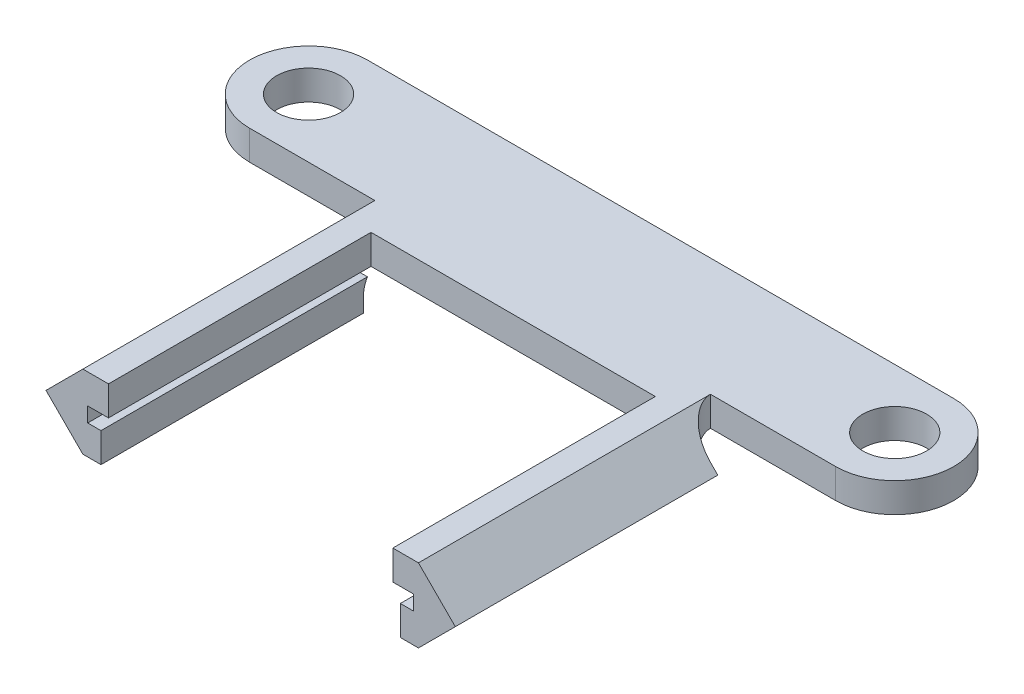
ISO-10303-21;
HEADER;
FILE_DESCRIPTION(('STEP AP214'),'2;1');
FILE_NAME('part.step','',(''),(''),'','','');
FILE_SCHEMA(('AUTOMOTIVE_DESIGN { 1 0 10303 214 1 1 1 1 }'));
ENDSEC;
DATA;
#1=APPLICATION_CONTEXT('core data for automotive mechanical design processes');
#2=APPLICATION_PROTOCOL_DEFINITION('international standard','automotive_design',2000,#1);
#3=PRODUCT_CONTEXT('',#1,'mechanical');
#4=PRODUCT('Part','Part','',(#3));
#5=PRODUCT_RELATED_PRODUCT_CATEGORY('part','',(#4));
#6=PRODUCT_DEFINITION_FORMATION('','',#4);
#7=PRODUCT_DEFINITION_CONTEXT('part definition',#1,'design');
#8=PRODUCT_DEFINITION('design','',#6,#7);
#9=PRODUCT_DEFINITION_SHAPE('','',#8);
#10=(LENGTH_UNIT() NAMED_UNIT(*) SI_UNIT(.MILLI.,.METRE.));
#11=(NAMED_UNIT(*) PLANE_ANGLE_UNIT() SI_UNIT($,.RADIAN.));
#12=(NAMED_UNIT(*) SI_UNIT($,.STERADIAN.) SOLID_ANGLE_UNIT());
#13=UNCERTAINTY_MEASURE_WITH_UNIT(LENGTH_MEASURE(1.E-05),#10,'distance_accuracy_value','');
#14=(GEOMETRIC_REPRESENTATION_CONTEXT(3) GLOBAL_UNCERTAINTY_ASSIGNED_CONTEXT((#13)) GLOBAL_UNIT_ASSIGNED_CONTEXT((#10,
#11,#12)) REPRESENTATION_CONTEXT('',''));
#15=CARTESIAN_POINT('',(0.,0.,0.));
#16=DIRECTION('',(0.,0.,1.));
#17=DIRECTION('',(1.,0.,0.));
#18=AXIS2_PLACEMENT_3D('',#15,#16,#17);
#19=CARTESIAN_POINT('',(0.,0.,0.));
#20=DIRECTION('',(0.,0.,-1.));
#21=DIRECTION('',(-1.,0.,0.));
#22=AXIS2_PLACEMENT_3D('',#19,#20,#21);
#23=PLANE('',#22);
#24=DIRECTION('',(0.,1.,0.));
#25=VECTOR('',#24,1.);
#26=CARTESIAN_POINT('',(26.289,0.,0.));
#27=LINE('',#26,#25);
#28=CARTESIAN_POINT('',(26.289,-2.54,0.));
#29=VERTEX_POINT('',#28);
#30=CARTESIAN_POINT('',(26.289,-1.27,0.));
#31=VERTEX_POINT('',#30);
#32=EDGE_CURVE('E305',#29,#31,#27,.T.);
#33=ORIENTED_EDGE('',*,*,#32,.T.);
#34=DIRECTION('',(-1.,0.,0.));
#35=VECTOR('',#34,1.);
#36=CARTESIAN_POINT('',(27.8491024484277,-1.27,0.));
#37=LINE('',#36,#35);
#38=CARTESIAN_POINT('',(29.1191024484277,-1.27,0.));
#39=VERTEX_POINT('',#38);
#40=EDGE_CURVE('E396',#31,#39,#37,.F.);
#41=ORIENTED_EDGE('',*,*,#40,.T.);
#42=DIRECTION('',(0.707106781186547,0.707106781186548,0.));
#43=VECTOR('',#42,1.);
#44=CARTESIAN_POINT('',(27.8491024484277,-2.54,0.));
#45=LINE('',#44,#43);
#46=CARTESIAN_POINT('',(27.8491024484277,-2.54,0.));
#47=VERTEX_POINT('',#46);
#48=EDGE_CURVE('E344',#47,#39,#45,.T.);
#49=ORIENTED_EDGE('',*,*,#48,.F.);
#50=DIRECTION('',(1.,0.,0.));
#51=VECTOR('',#50,1.);
#52=CARTESIAN_POINT('',(25.9715,-2.54,0.));
#53=LINE('',#52,#51);
#54=EDGE_CURVE('E362',#29,#47,#53,.T.);
#55=ORIENTED_EDGE('',*,*,#54,.F.);
#56=EDGE_LOOP('',(#33,#41,#49,#55));
#57=FACE_BOUND('',#56,.T.);
#58=ADVANCED_FACE('F33',(#57),#23,.T.);
#59=DIRECTION('',(0.707106781186548,-0.707106781186547,0.));
#60=VECTOR('',#59,1.);
#61=CARTESIAN_POINT('',(-1.05210244842766,-2.54,0.));
#62=LINE('',#61,#60);
#63=CARTESIAN_POINT('',(-2.32210244842766,-1.27,0.));
#64=VERTEX_POINT('',#63);
#65=CARTESIAN_POINT('',(-1.05210244842766,-2.54,0.));
#66=VERTEX_POINT('',#65);
#67=EDGE_CURVE('E339',#64,#66,#62,.T.);
#68=ORIENTED_EDGE('',*,*,#67,.F.);
#69=DIRECTION('',(-1.,0.,0.));
#70=VECTOR('',#69,1.);
#71=CARTESIAN_POINT('',(-0.635,-1.27,0.));
#72=LINE('',#71,#70);
#73=CARTESIAN_POINT('',(0.507999999999999,-1.27,0.));
#74=VERTEX_POINT('',#73);
#75=EDGE_CURVE('E390',#64,#74,#72,.F.);
#76=ORIENTED_EDGE('',*,*,#75,.T.);
#77=DIRECTION('',(0.,-1.,0.));
#78=VECTOR('',#77,1.);
#79=CARTESIAN_POINT('',(0.508,0.,0.));
#80=LINE('',#79,#78);
#81=CARTESIAN_POINT('',(0.507999999999998,-2.54,0.));
#82=VERTEX_POINT('',#81);
#83=EDGE_CURVE('E303',#74,#82,#80,.T.);
#84=ORIENTED_EDGE('',*,*,#83,.T.);
#85=EDGE_CURVE('E363',#66,#82,#53,.T.);
#86=ORIENTED_EDGE('',*,*,#85,.F.);
#87=EDGE_LOOP('',(#68,#76,#84,#86));
#88=FACE_BOUND('',#87,.T.);
#89=ADVANCED_FACE('F487',(#88),#23,.T.);
#90=CARTESIAN_POINT('',(31.0241024484277,0.635,22.606));
#91=DIRECTION('',(-0.707106781186547,-0.707106781186548,0.));
#92=DIRECTION('',(0.707106781186548,-0.707106781186547,0.));
#93=AXIS2_PLACEMENT_3D('',#90,#91,#92);
#94=PLANE('',#93);
#95=DIRECTION('',(-0.707106781186548,0.707106781186547,0.));
#96=VECTOR('',#95,1.);
#97=CARTESIAN_POINT('',(27.8491024484277,3.81,0.));
#98=LINE('',#97,#96);
#99=CARTESIAN_POINT('',(31.0241024484277,0.635,0.));
#100=VERTEX_POINT('',#99);
#101=CARTESIAN_POINT('',(30.3891024484277,1.27,0.));
#102=VERTEX_POINT('',#101);
#103=EDGE_CURVE('E266',#100,#102,#98,.T.);
#104=ORIENTED_EDGE('',*,*,#103,.T.);
#105=CARTESIAN_POINT('',(30.3891024484277,1.27,-2.54));
#106=DIRECTION('',(-0.707106781186547,-0.707106781186548,0.));
#107=DIRECTION('',(0.707106781186548,-0.707106781186547,0.));
#108=AXIS2_PLACEMENT_3D('',#105,#106,#107);
#109=ELLIPSE('',#108,3.59210244842766,2.54);
#110=CARTESIAN_POINT('',(27.8491024484277,3.81,-2.54));
#111=VERTEX_POINT('',#110);
#112=EDGE_CURVE('E12',#102,#111,#109,.T.);
#113=ORIENTED_EDGE('',*,*,#112,.T.);
#114=DIRECTION('',(0.,0.,-1.));
#115=VECTOR('',#114,1.);
#116=CARTESIAN_POINT('',(27.8491024484277,3.81,22.606));
#117=LINE('',#116,#115);
#118=CARTESIAN_POINT('',(27.8491024484277,3.81,22.606));
#119=VERTEX_POINT('',#118);
#120=EDGE_CURVE('E50',#119,#111,#117,.T.);
#121=ORIENTED_EDGE('',*,*,#120,.F.);
#122=DIRECTION('',(-0.707106781186548,0.707106781186547,0.));
#123=VECTOR('',#122,1.);
#124=CARTESIAN_POINT('',(31.0241024484277,0.635,22.606));
#125=LINE('',#124,#123);
#126=CARTESIAN_POINT('',(31.0241024484277,0.635,22.606));
#127=VERTEX_POINT('',#126);
#128=EDGE_CURVE('E350',#127,#119,#125,.T.);
#129=ORIENTED_EDGE('',*,*,#128,.F.);
#130=DIRECTION('',(0.,0.,-1.));
#131=VECTOR('',#130,1.);
#132=CARTESIAN_POINT('',(31.0241024484277,0.635,22.606));
#133=LINE('',#132,#131);
#134=EDGE_CURVE('E375',#127,#100,#133,.T.);
#135=ORIENTED_EDGE('',*,*,#134,.T.);
#136=EDGE_LOOP('',(#104,#113,#121,#129,#135));
#137=FACE_BOUND('',#136,.T.);
#138=ADVANCED_FACE('F494',(#137),#94,.F.);
#139=CARTESIAN_POINT('',(-4.22710244842766,0.634999999999996,22.606));
#140=DIRECTION('',(0.707106781186548,-0.707106781186547,0.));
#141=DIRECTION('',(0.707106781186547,0.707106781186548,0.));
#142=AXIS2_PLACEMENT_3D('',#139,#140,#141);
#143=PLANE('',#142);
#144=DIRECTION('',(0.,0.,-1.));
#145=VECTOR('',#144,1.);
#146=CARTESIAN_POINT('',(-1.05210244842766,3.81,22.606));
#147=LINE('',#146,#145);
#148=CARTESIAN_POINT('',(-1.05210244842766,3.81,22.606));
#149=VERTEX_POINT('',#148);
#150=CARTESIAN_POINT('',(-1.05210244842766,3.81,-2.53999999999999));
#151=VERTEX_POINT('',#150);
#152=EDGE_CURVE('E371',#149,#151,#147,.T.);
#153=ORIENTED_EDGE('',*,*,#152,.T.);
#154=CARTESIAN_POINT('',(-3.59210244842766,1.26999999999999,-2.54));
#155=DIRECTION('',(0.707106781186548,-0.707106781186547,0.));
#156=DIRECTION('',(0.707106781186547,0.707106781186548,0.));
#157=AXIS2_PLACEMENT_3D('',#154,#155,#156);
#158=ELLIPSE('',#157,3.59210244842766,2.54);
#159=CARTESIAN_POINT('',(-3.59210244842766,1.27,0.));
#160=VERTEX_POINT('',#159);
#161=EDGE_CURVE('E412',#151,#160,#158,.T.);
#162=ORIENTED_EDGE('',*,*,#161,.T.);
#163=DIRECTION('',(-0.707106781186547,-0.707106781186548,0.));
#164=VECTOR('',#163,1.);
#165=CARTESIAN_POINT('',(-1.05210244842766,3.81,0.));
#166=LINE('',#165,#164);
#167=CARTESIAN_POINT('',(-4.22710244842766,0.635000000000004,0.));
#168=VERTEX_POINT('',#167);
#169=EDGE_CURVE('E270',#160,#168,#166,.T.);
#170=ORIENTED_EDGE('',*,*,#169,.T.);
#171=DIRECTION('',(0.,0.,-1.));
#172=VECTOR('',#171,1.);
#173=CARTESIAN_POINT('',(-4.22710244842766,0.634999999999996,22.606));
#174=LINE('',#173,#172);
#175=CARTESIAN_POINT('',(-4.22710244842766,0.634999999999996,22.606));
#176=VERTEX_POINT('',#175);
#177=EDGE_CURVE('E358',#176,#168,#174,.T.);
#178=ORIENTED_EDGE('',*,*,#177,.F.);
#179=DIRECTION('',(-0.707106781186547,-0.707106781186548,0.));
#180=VECTOR('',#179,1.);
#181=CARTESIAN_POINT('',(-4.22710244842766,0.634999999999996,22.606));
#182=LINE('',#181,#180);
#183=EDGE_CURVE('E356',#149,#176,#182,.T.);
#184=ORIENTED_EDGE('',*,*,#183,.F.);
#185=EDGE_LOOP('',(#153,#162,#170,#178,#184));
#186=FACE_BOUND('',#185,.T.);
#187=ADVANCED_FACE('F537',(#186),#143,.F.);
#188=CARTESIAN_POINT('',(27.432,1.27,22.606));
#189=DIRECTION('',(-1.,0.,0.));
#190=DIRECTION('',(0.,0.,1.));
#191=AXIS2_PLACEMENT_3D('',#188,#189,#190);
#192=PLANE('',#191);
#193=DIRECTION('',(0.,0.,-1.));
#194=VECTOR('',#193,1.);
#195=CARTESIAN_POINT('',(27.432,1.27,22.606));
#196=LINE('',#195,#194);
#197=CARTESIAN_POINT('',(27.432,1.27,22.606));
#198=VERTEX_POINT('',#197);
#199=CARTESIAN_POINT('',(27.432,1.27,-2.53999999999999));
#200=VERTEX_POINT('',#199);
#201=EDGE_CURVE('E335',#198,#200,#196,.T.);
#202=ORIENTED_EDGE('',*,*,#201,.T.);
#203=CARTESIAN_POINT('',(27.432,-1.27,-2.54));
#204=DIRECTION('',(-1.,0.,0.));
#205=DIRECTION('',(0.,0.,1.));
#206=AXIS2_PLACEMENT_3D('',#203,#204,#205);
#207=CIRCLE('',#206,2.54);
#208=CARTESIAN_POINT('',(27.432,0.,-0.34029547438752));
#209=VERTEX_POINT('',#208);
#210=EDGE_CURVE('E416',#200,#209,#207,.F.);
#211=ORIENTED_EDGE('',*,*,#210,.T.);
#212=DIRECTION('',(0.,0.,-1.));
#213=VECTOR('',#212,1.);
#214=CARTESIAN_POINT('',(27.432,0.,22.606));
#215=LINE('',#214,#213);
#216=CARTESIAN_POINT('',(27.432,0.,22.606));
#217=VERTEX_POINT('',#216);
#218=EDGE_CURVE('E337',#217,#209,#215,.T.);
#219=ORIENTED_EDGE('',*,*,#218,.F.);
#220=DIRECTION('',(0.,1.,0.));
#221=VECTOR('',#220,1.);
#222=CARTESIAN_POINT('',(27.432,1.27,22.606));
#223=LINE('',#222,#221);
#224=EDGE_CURVE('E323',#217,#198,#223,.T.);
#225=ORIENTED_EDGE('',*,*,#224,.T.);
#226=EDGE_LOOP('',(#202,#211,#219,#225));
#227=FACE_BOUND('',#226,.T.);
#228=ADVANCED_FACE('F563',(#227),#192,.T.);
#229=CARTESIAN_POINT('',(-0.635,1.27,22.606));
#230=DIRECTION('',(1.,0.,0.));
#231=DIRECTION('',(0.,0.,-1.));
#232=AXIS2_PLACEMENT_3D('',#229,#230,#231);
#233=PLANE('',#232);
#234=DIRECTION('',(0.,0.,-1.));
#235=VECTOR('',#234,1.);
#236=CARTESIAN_POINT('',(-0.635,0.,22.606));
#237=LINE('',#236,#235);
#238=CARTESIAN_POINT('',(-0.635,0.,22.606));
#239=VERTEX_POINT('',#238);
#240=CARTESIAN_POINT('',(-0.635,0.,-0.34029547438752));
#241=VERTEX_POINT('',#240);
#242=EDGE_CURVE('E331',#239,#241,#237,.T.);
#243=ORIENTED_EDGE('',*,*,#242,.T.);
#244=CARTESIAN_POINT('',(-0.635,-1.27,-2.54));
#245=DIRECTION('',(1.,0.,0.));
#246=DIRECTION('',(0.,0.,-1.));
#247=AXIS2_PLACEMENT_3D('',#244,#245,#246);
#248=CIRCLE('',#247,2.54);
#249=CARTESIAN_POINT('',(-0.635,1.27,-2.53999999999999));
#250=VERTEX_POINT('',#249);
#251=EDGE_CURVE('E409',#241,#250,#248,.F.);
#252=ORIENTED_EDGE('',*,*,#251,.T.);
#253=DIRECTION('',(0.,0.,-1.));
#254=VECTOR('',#253,1.);
#255=CARTESIAN_POINT('',(-0.635,1.27,22.606));
#256=LINE('',#255,#254);
#257=CARTESIAN_POINT('',(-0.635,1.27,22.606));
#258=VERTEX_POINT('',#257);
#259=EDGE_CURVE('E333',#258,#250,#256,.T.);
#260=ORIENTED_EDGE('',*,*,#259,.F.);
#261=DIRECTION('',(0.,-1.,0.));
#262=VECTOR('',#261,1.);
#263=CARTESIAN_POINT('',(-0.635,1.27,22.606));
#264=LINE('',#263,#262);
#265=EDGE_CURVE('E329',#258,#239,#264,.T.);
#266=ORIENTED_EDGE('',*,*,#265,.T.);
#267=EDGE_LOOP('',(#243,#252,#260,#266));
#268=FACE_BOUND('',#267,.T.);
#269=ADVANCED_FACE('F523',(#268),#233,.T.);
#270=CARTESIAN_POINT('',(0.,0.,22.606));
#271=DIRECTION('',(0.,0.,-1.));
#272=DIRECTION('',(-1.,0.,0.));
#273=AXIS2_PLACEMENT_3D('',#270,#271,#272);
#274=PLANE('',#273);
#275=DIRECTION('',(-1.,0.,0.));
#276=VECTOR('',#275,1.);
#277=CARTESIAN_POINT('',(26.797,1.27,22.606));
#278=LINE('',#277,#276);
#279=CARTESIAN_POINT('',(1.1557,1.27,22.606));
#280=VERTEX_POINT('',#279);
#281=EDGE_CURVE('E325',#280,#258,#278,.T.);
#282=ORIENTED_EDGE('',*,*,#281,.F.);
#283=DIRECTION('',(0.,1.,0.));
#284=VECTOR('',#283,1.);
#285=CARTESIAN_POINT('',(1.1557,1.27,22.606));
#286=LINE('',#285,#284);
#287=CARTESIAN_POINT('',(1.1557,3.81,22.606));
#288=VERTEX_POINT('',#287);
#289=EDGE_CURVE('E283',#280,#288,#286,.T.);
#290=ORIENTED_EDGE('',*,*,#289,.T.);
#291=DIRECTION('',(-1.,0.,0.));
#292=VECTOR('',#291,1.);
#293=CARTESIAN_POINT('',(25.9715,3.81,22.606));
#294=LINE('',#293,#292);
#295=EDGE_CURVE('E352',#288,#149,#294,.T.);
#296=ORIENTED_EDGE('',*,*,#295,.T.);
#297=ORIENTED_EDGE('',*,*,#183,.T.);
#298=DIRECTION('',(0.707106781186548,-0.707106781186547,0.));
#299=VECTOR('',#298,1.);
#300=CARTESIAN_POINT('',(-1.05210244842766,-2.54,22.606));
#301=LINE('',#300,#299);
#302=CARTESIAN_POINT('',(-1.05210244842766,-2.54,22.606));
#303=VERTEX_POINT('',#302);
#304=EDGE_CURVE('E340',#176,#303,#301,.T.);
#305=ORIENTED_EDGE('',*,*,#304,.T.);
#306=DIRECTION('',(1.,0.,0.));
#307=VECTOR('',#306,1.);
#308=CARTESIAN_POINT('',(0.825500000000002,-2.54,22.606));
#309=LINE('',#308,#307);
#310=CARTESIAN_POINT('',(0.507999999999998,-2.54,22.606));
#311=VERTEX_POINT('',#310);
#312=EDGE_CURVE('E345',#303,#311,#309,.T.);
#313=ORIENTED_EDGE('',*,*,#312,.T.);
#314=DIRECTION('',(0.,-1.,0.));
#315=VECTOR('',#314,1.);
#316=CARTESIAN_POINT('',(0.508,0.,22.606));
#317=LINE('',#316,#315);
#318=CARTESIAN_POINT('',(0.508,0.,22.606));
#319=VERTEX_POINT('',#318);
#320=EDGE_CURVE('E302',#319,#311,#317,.T.);
#321=ORIENTED_EDGE('',*,*,#320,.F.);
#322=DIRECTION('',(1.,0.,0.));
#323=VECTOR('',#322,1.);
#324=CARTESIAN_POINT('',(-0.635,0.,22.606));
#325=LINE('',#324,#323);
#326=EDGE_CURVE('E320',#239,#319,#325,.T.);
#327=ORIENTED_EDGE('',*,*,#326,.F.);
#328=ORIENTED_EDGE('',*,*,#265,.F.);
#329=EDGE_LOOP('',(#282,#290,#296,#297,#305,#313,#321,#327,#328));
#330=FACE_BOUND('',#329,.T.);
#331=ADVANCED_FACE('F512',(#330),#274,.F.);
#332=ORIENTED_EDGE('',*,*,#169,.F.);
#333=DIRECTION('',(0.,1.,0.));
#334=VECTOR('',#333,1.);
#335=CARTESIAN_POINT('',(-3.59210244842766,0.,0.));
#336=LINE('',#335,#334);
#337=CARTESIAN_POINT('',(-3.59210244842766,0.,0.));
#338=VERTEX_POINT('',#337);
#339=EDGE_CURVE('E388',#160,#338,#336,.F.);
#340=ORIENTED_EDGE('',*,*,#339,.T.);
#341=EDGE_CURVE('E359',#168,#338,#62,.T.);
#342=ORIENTED_EDGE('',*,*,#341,.F.);
#343=EDGE_LOOP('',(#332,#340,#342));
#344=FACE_BOUND('',#343,.T.);
#345=ADVANCED_FACE('F496',(#344),#23,.T.);
#346=CARTESIAN_POINT('',(25.9715,-2.54,22.606));
#347=DIRECTION('',(0.,1.,0.));
#348=DIRECTION('',(0.,0.,1.));
#349=AXIS2_PLACEMENT_3D('',#346,#347,#348);
#350=PLANE('',#349);
#351=ORIENTED_EDGE('',*,*,#85,.T.);
#352=DIRECTION('',(0.,0.,1.));
#353=VECTOR('',#352,1.);
#354=CARTESIAN_POINT('',(0.507999999999998,-2.54,0.));
#355=LINE('',#354,#353);
#356=EDGE_CURVE('E309',#82,#311,#355,.T.);
#357=ORIENTED_EDGE('',*,*,#356,.T.);
#358=ORIENTED_EDGE('',*,*,#312,.F.);
#359=DIRECTION('',(0.,0.,-1.));
#360=VECTOR('',#359,1.);
#361=CARTESIAN_POINT('',(-1.05210244842766,-2.54,22.606));
#362=LINE('',#361,#360);
#363=EDGE_CURVE('E381',#303,#66,#362,.T.);
#364=ORIENTED_EDGE('',*,*,#363,.T.);
#365=EDGE_LOOP('',(#351,#357,#358,#364));
#366=FACE_BOUND('',#365,.T.);
#367=ADVANCED_FACE('F515',(#366),#350,.F.);
#368=CARTESIAN_POINT('',(27.432,0.,22.606));
#369=DIRECTION('',(0.,1.,0.));
#370=DIRECTION('',(0.,0.,1.));
#371=AXIS2_PLACEMENT_3D('',#368,#369,#370);
#372=PLANE('',#371);
#373=DIRECTION('',(0.,0.,1.));
#374=VECTOR('',#373,1.);
#375=CARTESIAN_POINT('',(0.508,0.,0.));
#376=LINE('',#375,#374);
#377=CARTESIAN_POINT('',(0.508,0.,-0.340295474387526));
#378=VERTEX_POINT('',#377);
#379=EDGE_CURVE('E312',#378,#319,#376,.T.);
#380=ORIENTED_EDGE('',*,*,#379,.F.);
#381=DIRECTION('',(1.,0.,0.));
#382=VECTOR('',#381,1.);
#383=CARTESIAN_POINT('',(0.508,0.,-0.340295474387526));
#384=LINE('',#383,#382);
#385=EDGE_CURVE('E406',#378,#241,#384,.F.);
#386=ORIENTED_EDGE('',*,*,#385,.T.);
#387=ORIENTED_EDGE('',*,*,#242,.F.);
#388=ORIENTED_EDGE('',*,*,#326,.T.);
#389=EDGE_LOOP('',(#380,#386,#387,#388));
#390=FACE_BOUND('',#389,.T.);
#391=ADVANCED_FACE('F510',(#390),#372,.T.);
#392=CARTESIAN_POINT('',(25.6413,3.81,22.606));
#393=VERTEX_POINT('',#392);
#394=EDGE_CURVE('E353',#119,#393,#294,.T.);
#395=ORIENTED_EDGE('',*,*,#394,.T.);
#396=DIRECTION('',(0.,1.,0.));
#397=VECTOR('',#396,1.);
#398=CARTESIAN_POINT('',(25.6413,1.27,22.606));
#399=LINE('',#398,#397);
#400=CARTESIAN_POINT('',(25.6413,1.27,22.606));
#401=VERTEX_POINT('',#400);
#402=EDGE_CURVE('E295',#401,#393,#399,.T.);
#403=ORIENTED_EDGE('',*,*,#402,.F.);
#404=EDGE_CURVE('E326',#198,#401,#278,.T.);
#405=ORIENTED_EDGE('',*,*,#404,.F.);
#406=ORIENTED_EDGE('',*,*,#224,.F.);
#407=CARTESIAN_POINT('',(26.289,0.,22.606));
#408=VERTEX_POINT('',#407);
#409=EDGE_CURVE('E314',#408,#217,#325,.T.);
#410=ORIENTED_EDGE('',*,*,#409,.F.);
#411=DIRECTION('',(0.,1.,0.));
#412=VECTOR('',#411,1.);
#413=CARTESIAN_POINT('',(26.289,0.,22.606));
#414=LINE('',#413,#412);
#415=CARTESIAN_POINT('',(26.289,-2.54,22.606));
#416=VERTEX_POINT('',#415);
#417=EDGE_CURVE('E306',#416,#408,#414,.T.);
#418=ORIENTED_EDGE('',*,*,#417,.F.);
#419=CARTESIAN_POINT('',(27.8491024484277,-2.54,22.606));
#420=VERTEX_POINT('',#419);
#421=EDGE_CURVE('E343',#416,#420,#309,.T.);
#422=ORIENTED_EDGE('',*,*,#421,.T.);
#423=DIRECTION('',(0.707106781186547,0.707106781186548,0.));
#424=VECTOR('',#423,1.);
#425=CARTESIAN_POINT('',(27.8491024484277,-2.54,22.606));
#426=LINE('',#425,#424);
#427=EDGE_CURVE('E348',#420,#127,#426,.T.);
#428=ORIENTED_EDGE('',*,*,#427,.T.);
#429=ORIENTED_EDGE('',*,*,#128,.T.);
#430=EDGE_LOOP('',(#395,#403,#405,#406,#410,#418,#422,#428,#429));
#431=FACE_BOUND('',#430,.T.);
#432=ADVANCED_FACE('F501',(#431),#274,.F.);
#433=CARTESIAN_POINT('',(30.3891024484277,0.,0.));
#434=VERTEX_POINT('',#433);
#435=EDGE_CURVE('E366',#434,#100,#45,.T.);
#436=ORIENTED_EDGE('',*,*,#435,.F.);
#437=DIRECTION('',(0.,-1.,0.));
#438=VECTOR('',#437,1.);
#439=CARTESIAN_POINT('',(30.3891024484277,0.,0.));
#440=LINE('',#439,#438);
#441=EDGE_CURVE('E394',#434,#102,#440,.F.);
#442=ORIENTED_EDGE('',*,*,#441,.T.);
#443=ORIENTED_EDGE('',*,*,#103,.F.);
#444=EDGE_LOOP('',(#436,#442,#443));
#445=FACE_BOUND('',#444,.T.);
#446=ADVANCED_FACE('F490',(#445),#23,.T.);
#447=CARTESIAN_POINT('',(-1.05210244842766,-2.54,22.606));
#448=DIRECTION('',(0.707106781186547,0.707106781186548,0.));
#449=DIRECTION('',(-0.707106781186548,0.707106781186547,0.));
#450=AXIS2_PLACEMENT_3D('',#447,#448,#449);
#451=PLANE('',#450);
#452=ORIENTED_EDGE('',*,*,#341,.T.);
#453=CARTESIAN_POINT('',(-3.59210244842766,0.,-2.54));
#454=DIRECTION('',(0.707106781186547,0.707106781186548,0.));
#455=DIRECTION('',(-0.707106781186548,0.707106781186547,0.));
#456=AXIS2_PLACEMENT_3D('',#453,#454,#455);
#457=ELLIPSE('',#456,3.59210244842766,2.54);
#458=CARTESIAN_POINT('',(-2.95710244842766,-0.634999999999999,-0.0806555751582914));
#459=VERTEX_POINT('',#458);
#460=EDGE_CURVE('E414',#338,#459,#457,.T.);
#461=ORIENTED_EDGE('',*,*,#460,.T.);
#462=CARTESIAN_POINT('',(-2.32210244842766,-1.27,-2.54));
#463=DIRECTION('',(0.707106781186547,0.707106781186548,0.));
#464=DIRECTION('',(0.707106781186548,-0.707106781186547,0.));
#465=AXIS2_PLACEMENT_3D('',#462,#463,#464);
#466=ELLIPSE('',#465,3.59210244842766,2.54);
#467=EDGE_CURVE('E401',#459,#64,#466,.T.);
#468=ORIENTED_EDGE('',*,*,#467,.T.);
#469=ORIENTED_EDGE('',*,*,#67,.T.);
#470=ORIENTED_EDGE('',*,*,#363,.F.);
#471=ORIENTED_EDGE('',*,*,#304,.F.);
#472=ORIENTED_EDGE('',*,*,#177,.T.);
#473=EDGE_LOOP('',(#452,#461,#468,#469,#470,#471,#472));
#474=FACE_BOUND('',#473,.T.);
#475=ADVANCED_FACE('F500',(#474),#451,.F.);
#476=ORIENTED_EDGE('',*,*,#421,.F.);
#477=DIRECTION('',(0.,0.,1.));
#478=VECTOR('',#477,1.);
#479=CARTESIAN_POINT('',(26.289,-2.54,0.));
#480=LINE('',#479,#478);
#481=EDGE_CURVE('E316',#29,#416,#480,.T.);
#482=ORIENTED_EDGE('',*,*,#481,.F.);
#483=ORIENTED_EDGE('',*,*,#54,.T.);
#484=DIRECTION('',(0.,0.,-1.));
#485=VECTOR('',#484,1.);
#486=CARTESIAN_POINT('',(27.8491024484277,-2.54,22.606));
#487=LINE('',#486,#485);
#488=EDGE_CURVE('E378',#420,#47,#487,.T.);
#489=ORIENTED_EDGE('',*,*,#488,.F.);
#490=EDGE_LOOP('',(#476,#482,#483,#489));
#491=FACE_BOUND('',#490,.T.);
#492=ADVANCED_FACE('F507',(#491),#350,.F.);
#493=CARTESIAN_POINT('',(27.8491024484277,-2.54,22.606));
#494=DIRECTION('',(-0.707106781186548,0.707106781186547,0.));
#495=DIRECTION('',(-0.707106781186547,-0.707106781186548,0.));
#496=AXIS2_PLACEMENT_3D('',#493,#494,#495);
#497=PLANE('',#496);
#498=ORIENTED_EDGE('',*,*,#48,.T.);
#499=CARTESIAN_POINT('',(29.1191024484277,-1.27,-2.54));
#500=DIRECTION('',(-0.707106781186548,0.707106781186547,0.));
#501=DIRECTION('',(0.707106781186547,0.707106781186548,0.));
#502=AXIS2_PLACEMENT_3D('',#499,#500,#501);
#503=ELLIPSE('',#502,3.59210244842766,2.54);
#504=CARTESIAN_POINT('',(29.7541024484277,-0.635000000000002,-0.0806555751582901));
#505=VERTEX_POINT('',#504);
#506=EDGE_CURVE('E423',#39,#505,#503,.T.);
#507=ORIENTED_EDGE('',*,*,#506,.T.);
#508=CARTESIAN_POINT('',(30.3891024484277,0.,-2.54));
#509=DIRECTION('',(-0.707106781186548,0.707106781186547,0.));
#510=DIRECTION('',(-0.707106781186547,-0.707106781186548,0.));
#511=AXIS2_PLACEMENT_3D('',#508,#509,#510);
#512=ELLIPSE('',#511,3.59210244842766,2.54);
#513=EDGE_CURVE('E42',#505,#434,#512,.T.);
#514=ORIENTED_EDGE('',*,*,#513,.T.);
#515=ORIENTED_EDGE('',*,*,#435,.T.);
#516=ORIENTED_EDGE('',*,*,#134,.F.);
#517=ORIENTED_EDGE('',*,*,#427,.F.);
#518=ORIENTED_EDGE('',*,*,#488,.T.);
#519=EDGE_LOOP('',(#498,#507,#514,#515,#516,#517,#518));
#520=FACE_BOUND('',#519,.T.);
#521=ADVANCED_FACE('F574',(#520),#497,.F.);
#522=CARTESIAN_POINT('',(0.825499999999998,3.81,22.606));
#523=DIRECTION('',(0.,-1.,0.));
#524=DIRECTION('',(1.,0.,0.));
#525=AXIS2_PLACEMENT_3D('',#522,#523,#524);
#526=PLANE('',#525);
#527=CARTESIAN_POINT('',(38.63848,3.81000000000001,-7.61999999999999));
#528=DIRECTION('',(0.,-1.,0.));
#529=DIRECTION('',(0.,0.,-1.));
#530=AXIS2_PLACEMENT_3D('',#527,#528,#529);
#531=CIRCLE('',#530,2.75);
#532=CARTESIAN_POINT('',(38.63848,3.81000000000001,-10.37));
#533=VERTEX_POINT('',#532);
#534=EDGE_CURVE('E457',#533,#533,#531,.T.);
#535=ORIENTED_EDGE('',*,*,#534,.T.);
#536=EDGE_LOOP('',(#535));
#537=FACE_BOUND('',#536,.T.);
#538=CARTESIAN_POINT('',(-11.84148,3.81000000000001,-7.62));
#539=DIRECTION('',(0.,-1.,0.));
#540=DIRECTION('',(0.,0.,-1.));
#541=AXIS2_PLACEMENT_3D('',#538,#539,#540);
#542=CIRCLE('',#541,2.75);
#543=CARTESIAN_POINT('',(-11.84148,3.81000000000001,-10.37));
#544=VERTEX_POINT('',#543);
#545=EDGE_CURVE('E246',#544,#544,#542,.T.);
#546=ORIENTED_EDGE('',*,*,#545,.T.);
#547=EDGE_LOOP('',(#546));
#548=FACE_BOUND('',#547,.T.);
#549=ORIENTED_EDGE('',*,*,#120,.T.);
#550=DIRECTION('',(1.,0.,0.));
#551=VECTOR('',#550,1.);
#552=CARTESIAN_POINT('',(27.8491024484277,3.81000000000001,-2.54));
#553=LINE('',#552,#551);
#554=CARTESIAN_POINT('',(38.63848,3.81000000000001,-2.54));
#555=VERTEX_POINT('',#554);
#556=EDGE_CURVE('E446',#111,#555,#553,.T.);
#557=ORIENTED_EDGE('',*,*,#556,.T.);
#558=CARTESIAN_POINT('',(38.63848,3.81000000000001,-7.61999999999999));
#559=DIRECTION('',(0.,-1.,0.));
#560=DIRECTION('',(1.,0.,0.));
#561=AXIS2_PLACEMENT_3D('',#558,#559,#560);
#562=CIRCLE('',#561,5.07999999999999);
#563=CARTESIAN_POINT('',(38.63848,3.81000000000001,-12.7));
#564=VERTEX_POINT('',#563);
#565=EDGE_CURVE('E259',#555,#564,#562,.F.);
#566=ORIENTED_EDGE('',*,*,#565,.T.);
#567=DIRECTION('',(1.,0.,0.));
#568=VECTOR('',#567,1.);
#569=CARTESIAN_POINT('',(-1.05210244842766,3.81,-12.7));
#570=LINE('',#569,#568);
#571=CARTESIAN_POINT('',(-11.84148,3.81,-12.7));
#572=VERTEX_POINT('',#571);
#573=EDGE_CURVE('E300',#572,#564,#570,.T.);
#574=ORIENTED_EDGE('',*,*,#573,.F.);
#575=CARTESIAN_POINT('',(-11.84148,3.81,-7.62));
#576=DIRECTION('',(0.,-1.,0.));
#577=DIRECTION('',(1.,0.,0.));
#578=AXIS2_PLACEMENT_3D('',#575,#576,#577);
#579=CIRCLE('',#578,5.07999999999999);
#580=CARTESIAN_POINT('',(-11.84148,3.81,-2.54000000000001));
#581=VERTEX_POINT('',#580);
#582=EDGE_CURVE('E264',#572,#581,#579,.F.);
#583=ORIENTED_EDGE('',*,*,#582,.T.);
#584=EDGE_CURVE('E238',#581,#151,#553,.T.);
#585=ORIENTED_EDGE('',*,*,#584,.T.);
#586=ORIENTED_EDGE('',*,*,#152,.F.);
#587=ORIENTED_EDGE('',*,*,#295,.F.);
#588=DIRECTION('',(0.,0.,1.));
#589=VECTOR('',#588,1.);
#590=CARTESIAN_POINT('',(1.1557,3.81,0.));
#591=LINE('',#590,#589);
#592=CARTESIAN_POINT('',(1.1557,3.81,0.));
#593=VERTEX_POINT('',#592);
#594=EDGE_CURVE('E269',#593,#288,#591,.T.);
#595=ORIENTED_EDGE('',*,*,#594,.F.);
#596=DIRECTION('',(-1.,0.,0.));
#597=VECTOR('',#596,1.);
#598=CARTESIAN_POINT('',(2.9845,3.81,0.));
#599=LINE('',#598,#597);
#600=CARTESIAN_POINT('',(25.6413,3.81,0.));
#601=VERTEX_POINT('',#600);
#602=EDGE_CURVE('E277',#601,#593,#599,.T.);
#603=ORIENTED_EDGE('',*,*,#602,.F.);
#604=DIRECTION('',(0.,0.,-1.));
#605=VECTOR('',#604,1.);
#606=CARTESIAN_POINT('',(25.6413,3.81,22.606));
#607=LINE('',#606,#605);
#608=EDGE_CURVE('E285',#393,#601,#607,.T.);
#609=ORIENTED_EDGE('',*,*,#608,.F.);
#610=ORIENTED_EDGE('',*,*,#394,.F.);
#611=EDGE_LOOP('',(#549,#557,#566,#574,#583,#585,#586,#587,#595,#603,#609,#610));
#612=FACE_BOUND('',#611,.T.);
#613=ADVANCED_FACE('F542',(#537,#548,#612),#526,.F.);
#614=DIRECTION('',(0.,0.,1.));
#615=VECTOR('',#614,1.);
#616=CARTESIAN_POINT('',(26.289,0.,0.));
#617=LINE('',#616,#615);
#618=CARTESIAN_POINT('',(26.289,0.,-0.340295474387526));
#619=VERTEX_POINT('',#618);
#620=EDGE_CURVE('E57',#619,#408,#617,.T.);
#621=ORIENTED_EDGE('',*,*,#620,.T.);
#622=ORIENTED_EDGE('',*,*,#409,.T.);
#623=ORIENTED_EDGE('',*,*,#218,.T.);
#624=DIRECTION('',(1.,0.,0.));
#625=VECTOR('',#624,1.);
#626=CARTESIAN_POINT('',(27.432,0.,-0.340295474387526));
#627=LINE('',#626,#625);
#628=EDGE_CURVE('E419',#209,#619,#627,.F.);
#629=ORIENTED_EDGE('',*,*,#628,.T.);
#630=EDGE_LOOP('',(#621,#622,#623,#629));
#631=FACE_BOUND('',#630,.T.);
#632=ADVANCED_FACE('F469',(#631),#372,.T.);
#633=CARTESIAN_POINT('',(0.,1.27,22.606));
#634=DIRECTION('',(0.,-1.,0.));
#635=DIRECTION('',(0.,0.,-1.));
#636=AXIS2_PLACEMENT_3D('',#633,#634,#635);
#637=PLANE('',#636);
#638=CARTESIAN_POINT('',(38.63848,1.27,-7.61999999999999));
#639=DIRECTION('',(0.,-1.,0.));
#640=DIRECTION('',(0.,0.,-1.));
#641=AXIS2_PLACEMENT_3D('',#638,#639,#640);
#642=CIRCLE('',#641,2.75);
#643=CARTESIAN_POINT('',(38.63848,1.27,-10.37));
#644=VERTEX_POINT('',#643);
#645=EDGE_CURVE('E460',#644,#644,#642,.T.);
#646=ORIENTED_EDGE('',*,*,#645,.F.);
#647=EDGE_LOOP('',(#646));
#648=FACE_BOUND('',#647,.T.);
#649=CARTESIAN_POINT('',(-11.84148,1.27,-7.62));
#650=DIRECTION('',(0.,-1.,0.));
#651=DIRECTION('',(0.,0.,-1.));
#652=AXIS2_PLACEMENT_3D('',#649,#650,#651);
#653=CIRCLE('',#652,2.75);
#654=CARTESIAN_POINT('',(-11.84148,1.27,-10.37));
#655=VERTEX_POINT('',#654);
#656=EDGE_CURVE('E251',#655,#655,#653,.T.);
#657=ORIENTED_EDGE('',*,*,#656,.F.);
#658=EDGE_LOOP('',(#657));
#659=FACE_BOUND('',#658,.T.);
#660=ORIENTED_EDGE('',*,*,#259,.T.);
#661=DIRECTION('',(-1.,0.,0.));
#662=VECTOR('',#661,1.);
#663=CARTESIAN_POINT('',(-1.05210244842766,1.27,-2.54));
#664=LINE('',#663,#662);
#665=CARTESIAN_POINT('',(-1.05210244842766,1.27,-2.54));
#666=VERTEX_POINT('',#665);
#667=EDGE_CURVE('E227',#250,#666,#664,.T.);
#668=ORIENTED_EDGE('',*,*,#667,.T.);
#669=DIRECTION('',(-1.,0.,0.));
#670=VECTOR('',#669,1.);
#671=CARTESIAN_POINT('',(27.8491024484277,1.27,-2.54));
#672=LINE('',#671,#670);
#673=CARTESIAN_POINT('',(-11.84148,1.27,-2.54000000000001));
#674=VERTEX_POINT('',#673);
#675=EDGE_CURVE('E221',#666,#674,#672,.T.);
#676=ORIENTED_EDGE('',*,*,#675,.T.);
#677=CARTESIAN_POINT('',(-11.84148,1.27,-7.62));
#678=DIRECTION('',(0.,-1.,0.));
#679=DIRECTION('',(0.,0.,1.));
#680=AXIS2_PLACEMENT_3D('',#677,#678,#679);
#681=CIRCLE('',#680,5.07999999999999);
#682=CARTESIAN_POINT('',(-11.84148,1.27,-12.7));
#683=VERTEX_POINT('',#682);
#684=EDGE_CURVE('E225',#674,#683,#681,.T.);
#685=ORIENTED_EDGE('',*,*,#684,.T.);
#686=DIRECTION('',(-1.,0.,0.));
#687=VECTOR('',#686,1.);
#688=CARTESIAN_POINT('',(27.432,1.27,-12.7));
#689=LINE('',#688,#687);
#690=CARTESIAN_POINT('',(38.63848,1.27,-12.7));
#691=VERTEX_POINT('',#690);
#692=EDGE_CURVE('E292',#691,#683,#689,.T.);
#693=ORIENTED_EDGE('',*,*,#692,.F.);
#694=CARTESIAN_POINT('',(38.63848,1.27,-7.61999999999999));
#695=DIRECTION('',(0.,-1.,0.));
#696=DIRECTION('',(0.,0.,-1.));
#697=AXIS2_PLACEMENT_3D('',#694,#695,#696);
#698=CIRCLE('',#697,5.07999999999999);
#699=CARTESIAN_POINT('',(38.63848,1.27,-2.54));
#700=VERTEX_POINT('',#699);
#701=EDGE_CURVE('E231',#691,#700,#698,.T.);
#702=ORIENTED_EDGE('',*,*,#701,.T.);
#703=CARTESIAN_POINT('',(27.8491024484277,1.27,-2.54));
#704=VERTEX_POINT('',#703);
#705=EDGE_CURVE('E230',#700,#704,#672,.T.);
#706=ORIENTED_EDGE('',*,*,#705,.T.);
#707=DIRECTION('',(-1.,0.,0.));
#708=VECTOR('',#707,1.);
#709=CARTESIAN_POINT('',(27.432,1.27,-2.54));
#710=LINE('',#709,#708);
#711=EDGE_CURVE('E384',#704,#200,#710,.T.);
#712=ORIENTED_EDGE('',*,*,#711,.T.);
#713=ORIENTED_EDGE('',*,*,#201,.F.);
#714=ORIENTED_EDGE('',*,*,#404,.T.);
#715=DIRECTION('',(0.,0.,-1.));
#716=VECTOR('',#715,1.);
#717=CARTESIAN_POINT('',(25.6413,1.27,22.606));
#718=LINE('',#717,#716);
#719=CARTESIAN_POINT('',(25.6413,1.27,0.));
#720=VERTEX_POINT('',#719);
#721=EDGE_CURVE('E276',#401,#720,#718,.T.);
#722=ORIENTED_EDGE('',*,*,#721,.T.);
#723=DIRECTION('',(-1.,0.,0.));
#724=VECTOR('',#723,1.);
#725=CARTESIAN_POINT('',(25.6413,1.27,0.));
#726=LINE('',#725,#724);
#727=CARTESIAN_POINT('',(1.1557,1.27,0.));
#728=VERTEX_POINT('',#727);
#729=EDGE_CURVE('E280',#720,#728,#726,.T.);
#730=ORIENTED_EDGE('',*,*,#729,.T.);
#731=DIRECTION('',(0.,0.,1.));
#732=VECTOR('',#731,1.);
#733=CARTESIAN_POINT('',(1.1557,1.27,0.));
#734=LINE('',#733,#732);
#735=EDGE_CURVE('E273',#728,#280,#734,.T.);
#736=ORIENTED_EDGE('',*,*,#735,.T.);
#737=ORIENTED_EDGE('',*,*,#281,.T.);
#738=EDGE_LOOP('',(#660,#668,#676,#685,#693,#702,#706,#712,#713,#714,#722,#730,#736,#737));
#739=FACE_BOUND('',#738,.T.);
#740=ADVANCED_FACE('F223',(#648,#659,#739),#637,.T.);
#741=CARTESIAN_POINT('',(26.289,0.,0.));
#742=DIRECTION('',(1.,0.,0.));
#743=DIRECTION('',(0.,0.,-1.));
#744=AXIS2_PLACEMENT_3D('',#741,#742,#743);
#745=PLANE('',#744);
#746=ORIENTED_EDGE('',*,*,#417,.T.);
#747=ORIENTED_EDGE('',*,*,#620,.F.);
#748=CARTESIAN_POINT('',(26.289,-1.27,-2.54));
#749=DIRECTION('',(1.,0.,0.));
#750=DIRECTION('',(0.,0.,-1.));
#751=AXIS2_PLACEMENT_3D('',#748,#749,#750);
#752=CIRCLE('',#751,2.54);
#753=EDGE_CURVE('E421',#619,#31,#752,.T.);
#754=ORIENTED_EDGE('',*,*,#753,.T.);
#755=ORIENTED_EDGE('',*,*,#32,.F.);
#756=ORIENTED_EDGE('',*,*,#481,.T.);
#757=EDGE_LOOP('',(#746,#747,#754,#755,#756));
#758=FACE_BOUND('',#757,.T.);
#759=ADVANCED_FACE('F468',(#758),#745,.F.);
#760=CARTESIAN_POINT('',(0.508,0.,0.));
#761=DIRECTION('',(-1.,0.,0.));
#762=DIRECTION('',(0.,-1.,0.));
#763=AXIS2_PLACEMENT_3D('',#760,#761,#762);
#764=PLANE('',#763);
#765=ORIENTED_EDGE('',*,*,#320,.T.);
#766=ORIENTED_EDGE('',*,*,#356,.F.);
#767=ORIENTED_EDGE('',*,*,#83,.F.);
#768=CARTESIAN_POINT('',(0.507999999999999,-1.27,-2.54));
#769=DIRECTION('',(-1.,0.,0.));
#770=DIRECTION('',(0.,-1.,0.));
#771=AXIS2_PLACEMENT_3D('',#768,#769,#770);
#772=CIRCLE('',#771,2.54);
#773=EDGE_CURVE('E403',#74,#378,#772,.T.);
#774=ORIENTED_EDGE('',*,*,#773,.T.);
#775=ORIENTED_EDGE('',*,*,#379,.T.);
#776=EDGE_LOOP('',(#765,#766,#767,#774,#775));
#777=FACE_BOUND('',#776,.T.);
#778=ADVANCED_FACE('F547',(#777),#764,.F.);
#779=CARTESIAN_POINT('',(0.,0.,-12.7));
#780=DIRECTION('',(0.,0.,1.));
#781=DIRECTION('',(1.,0.,0.));
#782=AXIS2_PLACEMENT_3D('',#779,#780,#781);
#783=PLANE('',#782);
#784=ORIENTED_EDGE('',*,*,#573,.T.);
#785=DIRECTION('',(0.,-1.,0.));
#786=VECTOR('',#785,1.);
#787=CARTESIAN_POINT('',(38.63848,65.2952043080414,-12.7));
#788=LINE('',#787,#786);
#789=EDGE_CURVE('E260',#564,#691,#788,.T.);
#790=ORIENTED_EDGE('',*,*,#789,.T.);
#791=ORIENTED_EDGE('',*,*,#692,.T.);
#792=DIRECTION('',(0.,-1.,0.));
#793=VECTOR('',#792,1.);
#794=CARTESIAN_POINT('',(-11.84148,65.2952043080414,-12.7));
#795=LINE('',#794,#793);
#796=EDGE_CURVE('E241',#572,#683,#795,.T.);
#797=ORIENTED_EDGE('',*,*,#796,.F.);
#798=EDGE_LOOP('',(#784,#790,#791,#797));
#799=FACE_BOUND('',#798,.T.);
#800=ADVANCED_FACE('F544',(#799),#783,.F.);
#801=CARTESIAN_POINT('',(1.1557,1.27,0.));
#802=DIRECTION('',(-1.,0.,0.));
#803=DIRECTION('',(0.,0.,1.));
#804=AXIS2_PLACEMENT_3D('',#801,#802,#803);
#805=PLANE('',#804);
#806=ORIENTED_EDGE('',*,*,#594,.T.);
#807=ORIENTED_EDGE('',*,*,#289,.F.);
#808=ORIENTED_EDGE('',*,*,#735,.F.);
#809=DIRECTION('',(0.,1.,0.));
#810=VECTOR('',#809,1.);
#811=CARTESIAN_POINT('',(1.1557,1.27,0.));
#812=LINE('',#811,#810);
#813=EDGE_CURVE('E290',#728,#593,#812,.T.);
#814=ORIENTED_EDGE('',*,*,#813,.T.);
#815=EDGE_LOOP('',(#806,#807,#808,#814));
#816=FACE_BOUND('',#815,.T.);
#817=ADVANCED_FACE('F546',(#816),#805,.F.);
#818=CARTESIAN_POINT('',(2.9845,1.27,0.));
#819=DIRECTION('',(0.,0.,-1.));
#820=DIRECTION('',(-1.,0.,0.));
#821=AXIS2_PLACEMENT_3D('',#818,#819,#820);
#822=PLANE('',#821);
#823=ORIENTED_EDGE('',*,*,#602,.T.);
#824=ORIENTED_EDGE('',*,*,#813,.F.);
#825=ORIENTED_EDGE('',*,*,#729,.F.);
#826=DIRECTION('',(0.,1.,0.));
#827=VECTOR('',#826,1.);
#828=CARTESIAN_POINT('',(25.6413,1.27,0.));
#829=LINE('',#828,#827);
#830=EDGE_CURVE('E293',#720,#601,#829,.T.);
#831=ORIENTED_EDGE('',*,*,#830,.T.);
#832=EDGE_LOOP('',(#823,#824,#825,#831));
#833=FACE_BOUND('',#832,.T.);
#834=ADVANCED_FACE('F553',(#833),#822,.F.);
#835=CARTESIAN_POINT('',(25.6413,1.27,22.606));
#836=DIRECTION('',(1.,0.,0.));
#837=DIRECTION('',(0.,0.,-1.));
#838=AXIS2_PLACEMENT_3D('',#835,#836,#837);
#839=PLANE('',#838);
#840=ORIENTED_EDGE('',*,*,#608,.T.);
#841=ORIENTED_EDGE('',*,*,#830,.F.);
#842=ORIENTED_EDGE('',*,*,#721,.F.);
#843=ORIENTED_EDGE('',*,*,#402,.T.);
#844=EDGE_LOOP('',(#840,#841,#842,#843));
#845=FACE_BOUND('',#844,.T.);
#846=ADVANCED_FACE('F600',(#845),#839,.F.);
#847=CARTESIAN_POINT('',(-3.59210244842766,1.27,-2.54));
#848=DIRECTION('',(0.,1.,0.));
#849=DIRECTION('',(0.,0.,1.));
#850=AXIS2_PLACEMENT_3D('',#847,#848,#849);
#851=CYLINDRICAL_SURFACE('',#850,2.54);
#852=ORIENTED_EDGE('',*,*,#161,.F.);
#853=DIRECTION('',(0.,1.,0.));
#854=VECTOR('',#853,1.);
#855=CARTESIAN_POINT('',(-1.05210244842766,1.27,-2.54));
#856=LINE('',#855,#854);
#857=EDGE_CURVE('E392',#666,#151,#856,.T.);
#858=ORIENTED_EDGE('',*,*,#857,.F.);
#859=CARTESIAN_POINT('',(-3.59210244842766,-1.27,-2.54));
#860=DIRECTION('',(0.707106781186547,-0.707106781186547,0.));
#861=DIRECTION('',(0.707106781186547,0.707106781186547,0.));
#862=AXIS2_PLACEMENT_3D('',#859,#860,#861);
#863=ELLIPSE('',#862,3.59210244842766,2.54);
#864=EDGE_CURVE('E272',#459,#666,#863,.F.);
#865=ORIENTED_EDGE('',*,*,#864,.F.);
#866=ORIENTED_EDGE('',*,*,#460,.F.);
#867=ORIENTED_EDGE('',*,*,#339,.F.);
#868=EDGE_LOOP('',(#852,#858,#865,#866,#867));
#869=FACE_BOUND('',#868,.T.);
#870=ADVANCED_FACE('F532',(#869),#851,.F.);
#871=CARTESIAN_POINT('',(0.,-1.27,-2.54));
#872=DIRECTION('',(1.,0.,0.));
#873=DIRECTION('',(0.,0.,-1.));
#874=AXIS2_PLACEMENT_3D('',#871,#872,#873);
#875=CYLINDRICAL_SURFACE('',#874,2.54);
#876=ORIENTED_EDGE('',*,*,#773,.F.);
#877=ORIENTED_EDGE('',*,*,#75,.F.);
#878=ORIENTED_EDGE('',*,*,#467,.F.);
#879=ORIENTED_EDGE('',*,*,#864,.T.);
#880=ORIENTED_EDGE('',*,*,#667,.F.);
#881=ORIENTED_EDGE('',*,*,#251,.F.);
#882=ORIENTED_EDGE('',*,*,#385,.F.);
#883=EDGE_LOOP('',(#876,#877,#878,#879,#880,#881,#882));
#884=FACE_BOUND('',#883,.T.);
#885=ADVANCED_FACE('F590',(#884),#875,.F.);
#886=CARTESIAN_POINT('',(30.3891024484277,1.27,-2.54));
#887=DIRECTION('',(0.,-1.,0.));
#888=DIRECTION('',(0.,0.,-1.));
#889=AXIS2_PLACEMENT_3D('',#886,#887,#888);
#890=CYLINDRICAL_SURFACE('',#889,2.54);
#891=ORIENTED_EDGE('',*,*,#441,.F.);
#892=ORIENTED_EDGE('',*,*,#513,.F.);
#893=CARTESIAN_POINT('',(30.3891024484277,-1.27,-2.54));
#894=DIRECTION('',(0.707106781186547,0.707106781186547,0.));
#895=DIRECTION('',(0.707106781186547,-0.707106781186547,0.));
#896=AXIS2_PLACEMENT_3D('',#893,#894,#895);
#897=ELLIPSE('',#896,3.59210244842766,2.54);
#898=EDGE_CURVE('E37',#704,#505,#897,.T.);
#899=ORIENTED_EDGE('',*,*,#898,.F.);
#900=DIRECTION('',(0.,-1.,0.));
#901=VECTOR('',#900,1.);
#902=CARTESIAN_POINT('',(27.8491024484277,1.27,-2.54));
#903=LINE('',#902,#901);
#904=EDGE_CURVE('E398',#111,#704,#903,.T.);
#905=ORIENTED_EDGE('',*,*,#904,.F.);
#906=ORIENTED_EDGE('',*,*,#112,.F.);
#907=EDGE_LOOP('',(#891,#892,#899,#905,#906));
#908=FACE_BOUND('',#907,.T.);
#909=ADVANCED_FACE('F35',(#908),#890,.F.);
#910=CARTESIAN_POINT('',(0.,-1.27,-2.54));
#911=DIRECTION('',(1.,0.,0.));
#912=DIRECTION('',(0.,0.,-1.));
#913=AXIS2_PLACEMENT_3D('',#910,#911,#912);
#914=CYLINDRICAL_SURFACE('',#913,2.54);
#915=ORIENTED_EDGE('',*,*,#506,.F.);
#916=ORIENTED_EDGE('',*,*,#40,.F.);
#917=ORIENTED_EDGE('',*,*,#753,.F.);
#918=ORIENTED_EDGE('',*,*,#628,.F.);
#919=ORIENTED_EDGE('',*,*,#210,.F.);
#920=ORIENTED_EDGE('',*,*,#711,.F.);
#921=ORIENTED_EDGE('',*,*,#898,.T.);
#922=EDGE_LOOP('',(#915,#916,#917,#918,#919,#920,#921));
#923=FACE_BOUND('',#922,.T.);
#924=ADVANCED_FACE('F433',(#923),#914,.F.);
#925=CARTESIAN_POINT('',(38.63848,65.2952043080414,-7.61999999999999));
#926=DIRECTION('',(0.,-1.,0.));
#927=DIRECTION('',(0.,0.,-1.));
#928=AXIS2_PLACEMENT_3D('',#925,#926,#927);
#929=CYLINDRICAL_SURFACE('',#928,5.07999999999999);
#930=ORIENTED_EDGE('',*,*,#565,.F.);
#931=DIRECTION('',(0.,-1.,0.));
#932=VECTOR('',#931,1.);
#933=CARTESIAN_POINT('',(38.63848,65.2952043080414,-2.54));
#934=LINE('',#933,#932);
#935=EDGE_CURVE('E257',#555,#700,#934,.T.);
#936=ORIENTED_EDGE('',*,*,#935,.T.);
#937=ORIENTED_EDGE('',*,*,#701,.F.);
#938=ORIENTED_EDGE('',*,*,#789,.F.);
#939=EDGE_LOOP('',(#930,#936,#937,#938));
#940=FACE_BOUND('',#939,.T.);
#941=ADVANCED_FACE('F452',(#940),#929,.T.);
#942=CARTESIAN_POINT('',(27.8491024484277,65.2952043080414,-2.54));
#943=DIRECTION('',(0.,0.,1.));
#944=DIRECTION('',(1.,0.,0.));
#945=AXIS2_PLACEMENT_3D('',#942,#943,#944);
#946=PLANE('',#945);
#947=ORIENTED_EDGE('',*,*,#904,.T.);
#948=ORIENTED_EDGE('',*,*,#705,.F.);
#949=ORIENTED_EDGE('',*,*,#935,.F.);
#950=ORIENTED_EDGE('',*,*,#556,.F.);
#951=EDGE_LOOP('',(#947,#948,#949,#950));
#952=FACE_BOUND('',#951,.T.);
#953=ADVANCED_FACE('F444',(#952),#946,.T.);
#954=ORIENTED_EDGE('',*,*,#857,.T.);
#955=ORIENTED_EDGE('',*,*,#584,.F.);
#956=DIRECTION('',(0.,-1.,0.));
#957=VECTOR('',#956,1.);
#958=CARTESIAN_POINT('',(-11.84148,65.2952043080414,-2.54000000000001));
#959=LINE('',#958,#957);
#960=EDGE_CURVE('E235',#581,#674,#959,.T.);
#961=ORIENTED_EDGE('',*,*,#960,.T.);
#962=ORIENTED_EDGE('',*,*,#675,.F.);
#963=EDGE_LOOP('',(#954,#955,#961,#962));
#964=FACE_BOUND('',#963,.T.);
#965=ADVANCED_FACE('F236',(#964),#946,.T.);
#966=CARTESIAN_POINT('',(-11.84148,65.2952043080414,-7.62));
#967=DIRECTION('',(0.,-1.,0.));
#968=DIRECTION('',(0.,0.,-1.));
#969=AXIS2_PLACEMENT_3D('',#966,#967,#968);
#970=CYLINDRICAL_SURFACE('',#969,5.07999999999999);
#971=ORIENTED_EDGE('',*,*,#582,.F.);
#972=ORIENTED_EDGE('',*,*,#796,.T.);
#973=ORIENTED_EDGE('',*,*,#684,.F.);
#974=ORIENTED_EDGE('',*,*,#960,.F.);
#975=EDGE_LOOP('',(#971,#972,#973,#974));
#976=FACE_BOUND('',#975,.T.);
#977=ADVANCED_FACE('F244',(#976),#970,.T.);
#978=CARTESIAN_POINT('',(-11.84148,1.27,-7.62));
#979=DIRECTION('',(0.,-1.,0.));
#980=DIRECTION('',(0.,0.,-1.));
#981=AXIS2_PLACEMENT_3D('',#978,#979,#980);
#982=CYLINDRICAL_SURFACE('',#981,2.75);
#983=ORIENTED_EDGE('',*,*,#545,.F.);
#984=EDGE_LOOP('',(#983));
#985=FACE_BOUND('',#984,.T.);
#986=ORIENTED_EDGE('',*,*,#656,.T.);
#987=EDGE_LOOP('',(#986));
#988=FACE_BOUND('',#987,.T.);
#989=ADVANCED_FACE('F473',(#985,#988),#982,.F.);
#990=CARTESIAN_POINT('',(38.63848,1.27,-7.61999999999999));
#991=DIRECTION('',(0.,-1.,0.));
#992=DIRECTION('',(0.,0.,-1.));
#993=AXIS2_PLACEMENT_3D('',#990,#991,#992);
#994=CYLINDRICAL_SURFACE('',#993,2.75);
#995=ORIENTED_EDGE('',*,*,#534,.F.);
#996=EDGE_LOOP('',(#995));
#997=FACE_BOUND('',#996,.T.);
#998=ORIENTED_EDGE('',*,*,#645,.T.);
#999=EDGE_LOOP('',(#998));
#1000=FACE_BOUND('',#999,.T.);
#1001=ADVANCED_FACE('F464',(#997,#1000),#994,.F.);
#1002=CLOSED_SHELL('',(#58,#89,#138,#187,#228,#269,#331,#345,#367,#391,#432,#446,#475,#492,#521,
#613,#632,#740,#759,#778,#800,#817,#834,#846,#870,#885,#909,#924,#941,#953,#965,#977,#989,#1001));
#1003=MANIFOLD_SOLID_BREP('B2',#1002);
#1004=ADVANCED_BREP_SHAPE_REPRESENTATION('',(#18,#1003),#14);
#1005=SHAPE_DEFINITION_REPRESENTATION(#9,#1004);
ENDSEC;
END-ISO-10303-21;
